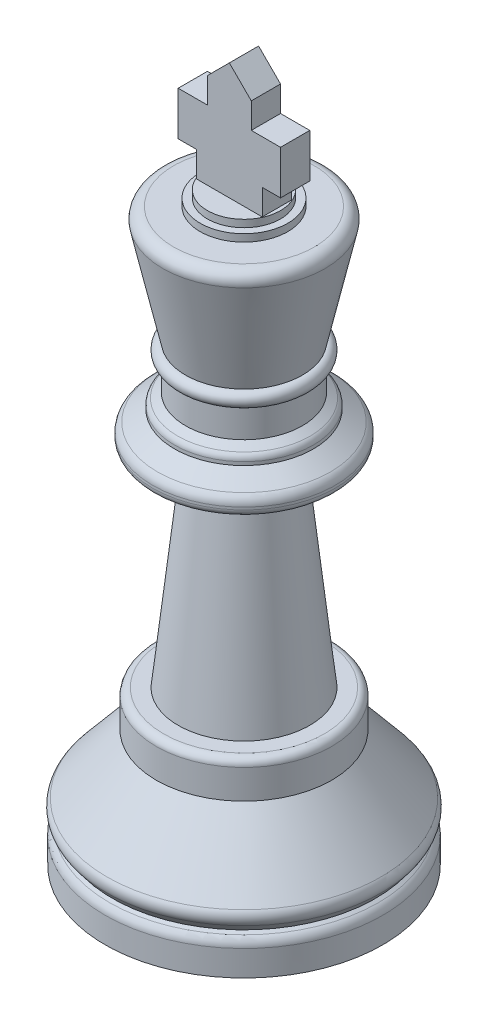
ISO-10303-21;
HEADER;
FILE_DESCRIPTION(('STEP AP214'),'2;1');
FILE_NAME('part.step','',(''),(''),'','','');
FILE_SCHEMA(('AUTOMOTIVE_DESIGN { 1 0 10303 214 1 1 1 1 }'));
ENDSEC;
DATA;
#1=APPLICATION_CONTEXT('core data for automotive mechanical design processes');
#2=APPLICATION_PROTOCOL_DEFINITION('international standard','automotive_design',2000,#1);
#3=PRODUCT_CONTEXT('',#1,'mechanical');
#4=PRODUCT('Part','Part','',(#3));
#5=PRODUCT_RELATED_PRODUCT_CATEGORY('part','',(#4));
#6=PRODUCT_DEFINITION_FORMATION('','',#4);
#7=PRODUCT_DEFINITION_CONTEXT('part definition',#1,'design');
#8=PRODUCT_DEFINITION('design','',#6,#7);
#9=PRODUCT_DEFINITION_SHAPE('','',#8);
#10=(LENGTH_UNIT() NAMED_UNIT(*) SI_UNIT(.MILLI.,.METRE.));
#11=(NAMED_UNIT(*) PLANE_ANGLE_UNIT() SI_UNIT($,.RADIAN.));
#12=(NAMED_UNIT(*) SI_UNIT($,.STERADIAN.) SOLID_ANGLE_UNIT());
#13=UNCERTAINTY_MEASURE_WITH_UNIT(LENGTH_MEASURE(1.E-05),#10,'distance_accuracy_value','');
#14=(GEOMETRIC_REPRESENTATION_CONTEXT(3) GLOBAL_UNCERTAINTY_ASSIGNED_CONTEXT((#13)) GLOBAL_UNIT_ASSIGNED_CONTEXT((#10,
#11,#12)) REPRESENTATION_CONTEXT('',''));
#15=CARTESIAN_POINT('',(0.,0.,0.));
#16=DIRECTION('',(0.,0.,1.));
#17=DIRECTION('',(1.,0.,0.));
#18=AXIS2_PLACEMENT_3D('',#15,#16,#17);
#19=CARTESIAN_POINT('',(0.,80.,0.));
#20=DIRECTION('',(0.,1.,0.));
#21=DIRECTION('',(0.,0.,1.));
#22=AXIS2_PLACEMENT_3D('',#19,#20,#21);
#23=PLANE('',#22);
#24=DIRECTION('',(0.,0.,1.));
#25=VECTOR('',#24,1.);
#26=CARTESIAN_POINT('',(-4.5,80.,-2.));
#27=LINE('',#26,#25);
#28=CARTESIAN_POINT('',(-4.5,80.,-2.));
#29=VERTEX_POINT('',#28);
#30=CARTESIAN_POINT('',(-4.5,80.,2.));
#31=VERTEX_POINT('',#30);
#32=EDGE_CURVE('E755',#29,#31,#27,.T.);
#33=ORIENTED_EDGE('',*,*,#32,.F.);
#34=DIRECTION('',(1.,0.,0.));
#35=VECTOR('',#34,1.);
#36=CARTESIAN_POINT('',(4.5,80.,-2.));
#37=LINE('',#36,#35);
#38=CARTESIAN_POINT('',(4.5,80.,-2.));
#39=VERTEX_POINT('',#38);
#40=EDGE_CURVE('E164',#29,#39,#37,.T.);
#41=ORIENTED_EDGE('',*,*,#40,.T.);
#42=DIRECTION('',(0.,0.,1.));
#43=VECTOR('',#42,1.);
#44=CARTESIAN_POINT('',(4.5,80.,-2.));
#45=LINE('',#44,#43);
#46=CARTESIAN_POINT('',(4.5,80.,2.));
#47=VERTEX_POINT('',#46);
#48=EDGE_CURVE('E193',#39,#47,#45,.T.);
#49=ORIENTED_EDGE('',*,*,#48,.T.);
#50=DIRECTION('',(1.,0.,0.));
#51=VECTOR('',#50,1.);
#52=CARTESIAN_POINT('',(4.5,80.,2.));
#53=LINE('',#52,#51);
#54=EDGE_CURVE('E752',#31,#47,#53,.T.);
#55=ORIENTED_EDGE('',*,*,#54,.F.);
#56=EDGE_LOOP('',(#33,#41,#49,#55));
#57=FACE_BOUND('',#56,.T.);
#58=CARTESIAN_POINT('',(0.,80.,0.));
#59=DIRECTION('',(0.,-1.,0.));
#60=DIRECTION('',(0.,0.,-1.));
#61=AXIS2_PLACEMENT_3D('',#58,#59,#60);
#62=CIRCLE('',#61,5.);
#63=CARTESIAN_POINT('',(0.,80.,-5.));
#64=VERTEX_POINT('',#63);
#65=EDGE_CURVE('E155',#64,#64,#62,.T.);
#66=ORIENTED_EDGE('',*,*,#65,.F.);
#67=EDGE_LOOP('',(#66));
#68=FACE_BOUND('',#67,.T.);
#69=ADVANCED_FACE('F39',(#57,#68),#23,.T.);
#70=CARTESIAN_POINT('',(19.,0.,0.));
#71=DIRECTION('',(0.,-1.,0.));
#72=DIRECTION('',(0.,0.,-1.));
#73=AXIS2_PLACEMENT_3D('',#70,#71,#72);
#74=PLANE('',#73);
#75=CARTESIAN_POINT('',(0.,0.,0.));
#76=DIRECTION('',(0.,-1.,0.));
#77=DIRECTION('',(0.,0.,-1.));
#78=AXIS2_PLACEMENT_3D('',#75,#76,#77);
#79=CIRCLE('',#78,19.);
#80=CARTESIAN_POINT('',(0.,0.,-19.));
#81=VERTEX_POINT('',#80);
#82=EDGE_CURVE('E259',#81,#81,#79,.T.);
#83=ORIENTED_EDGE('',*,*,#82,.T.);
#84=EDGE_LOOP('',(#83));
#85=FACE_BOUND('',#84,.T.);
#86=ADVANCED_FACE('F327',(#85),#74,.T.);
#87=CARTESIAN_POINT('',(0.,0.,0.));
#88=DIRECTION('',(0.,-1.,0.));
#89=DIRECTION('',(0.,0.,-1.));
#90=AXIS2_PLACEMENT_3D('',#87,#88,#89);
#91=CYLINDRICAL_SURFACE('',#90,19.);
#92=CARTESIAN_POINT('',(0.,3.5,0.));
#93=DIRECTION('',(0.,1.,0.));
#94=DIRECTION('',(0.,0.,1.));
#95=AXIS2_PLACEMENT_3D('',#92,#93,#94);
#96=CIRCLE('',#95,19.);
#97=CARTESIAN_POINT('',(0.,3.5,19.));
#98=VERTEX_POINT('',#97);
#99=EDGE_CURVE('E263',#98,#98,#96,.F.);
#100=ORIENTED_EDGE('',*,*,#99,.T.);
#101=EDGE_LOOP('',(#100));
#102=FACE_BOUND('',#101,.T.);
#103=ORIENTED_EDGE('',*,*,#82,.F.);
#104=EDGE_LOOP('',(#103));
#105=FACE_BOUND('',#104,.T.);
#106=ADVANCED_FACE('F333',(#102,#105),#91,.T.);
#107=CARTESIAN_POINT('',(0.,4.25,0.));
#108=DIRECTION('',(0.,-1.,0.));
#109=DIRECTION('',(0.,0.,-1.));
#110=AXIS2_PLACEMENT_3D('',#107,#108,#109);
#111=CONICAL_SURFACE('',#110,19.,0.927295218001615);
#112=CARTESIAN_POINT('',(0.,4.7,0.));
#113=DIRECTION('',(0.,1.,0.));
#114=DIRECTION('',(0.,0.,1.));
#115=AXIS2_PLACEMENT_3D('',#112,#113,#114);
#116=CIRCLE('',#115,18.4);
#117=CARTESIAN_POINT('',(0.,4.7,18.4));
#118=VERTEX_POINT('',#117);
#119=EDGE_CURVE('E267',#118,#118,#116,.T.);
#120=ORIENTED_EDGE('',*,*,#119,.T.);
#121=EDGE_LOOP('',(#120));
#122=FACE_BOUND('',#121,.T.);
#123=CARTESIAN_POINT('',(0.,5.,0.));
#124=DIRECTION('',(0.,-1.,0.));
#125=DIRECTION('',(0.,0.,-1.));
#126=AXIS2_PLACEMENT_3D('',#123,#124,#125);
#127=CIRCLE('',#126,18.);
#128=CARTESIAN_POINT('',(0.,5.,-18.));
#129=VERTEX_POINT('',#128);
#130=EDGE_CURVE('E255',#129,#129,#127,.T.);
#131=ORIENTED_EDGE('',*,*,#130,.T.);
#132=EDGE_LOOP('',(#131));
#133=FACE_BOUND('',#132,.T.);
#134=ADVANCED_FACE('F407',(#122,#133),#111,.T.);
#135=CARTESIAN_POINT('',(0.,5.,0.));
#136=DIRECTION('',(0.,1.,0.));
#137=DIRECTION('',(0.,0.,1.));
#138=AXIS2_PLACEMENT_3D('',#135,#136,#137);
#139=CONICAL_SURFACE('',#138,18.,0.643501108793284);
#140=CARTESIAN_POINT('',(0.,6.05101320906738,0.));
#141=DIRECTION('',(0.,-1.,0.));
#142=DIRECTION('',(0.,0.,-1.));
#143=AXIS2_PLACEMENT_3D('',#140,#141,#142);
#144=CIRCLE('',#143,18.7882599068005);
#145=CARTESIAN_POINT('',(0.,6.05101320906738,-18.7882599068005));
#146=VERTEX_POINT('',#145);
#147=EDGE_CURVE('E271',#146,#146,#144,.T.);
#148=ORIENTED_EDGE('',*,*,#147,.T.);
#149=EDGE_LOOP('',(#148));
#150=FACE_BOUND('',#149,.T.);
#151=ORIENTED_EDGE('',*,*,#130,.F.);
#152=EDGE_LOOP('',(#151));
#153=FACE_BOUND('',#152,.T.);
#154=ADVANCED_FACE('F403',(#150,#153),#139,.T.);
#155=CARTESIAN_POINT('',(0.,7.,0.));
#156=DIRECTION('',(0.,-1.,0.));
#157=DIRECTION('',(0.,0.,-1.));
#158=AXIS2_PLACEMENT_3D('',#155,#156,#157);
#159=CONICAL_SURFACE('',#158,19.5,0.694738276196703);
#160=CARTESIAN_POINT('',(0.,7.91128980856409,0.));
#161=DIRECTION('',(0.,1.,0.));
#162=DIRECTION('',(0.,0.,1.));
#163=AXIS2_PLACEMENT_3D('',#160,#161,#162);
#164=CIRCLE('',#163,18.7405918261966);
#165=CARTESIAN_POINT('',(0.,7.91128980856409,18.7405918261966));
#166=VERTEX_POINT('',#165);
#167=EDGE_CURVE('E275',#166,#166,#164,.T.);
#168=ORIENTED_EDGE('',*,*,#167,.T.);
#169=EDGE_LOOP('',(#168));
#170=FACE_BOUND('',#169,.T.);
#171=CARTESIAN_POINT('',(0.,16.,0.));
#172=DIRECTION('',(0.,-1.,0.));
#173=DIRECTION('',(0.,0.,-1.));
#174=AXIS2_PLACEMENT_3D('',#171,#172,#173);
#175=CIRCLE('',#174,12.);
#176=CARTESIAN_POINT('',(0.,16.,-12.));
#177=VERTEX_POINT('',#176);
#178=EDGE_CURVE('E251',#177,#177,#175,.T.);
#179=ORIENTED_EDGE('',*,*,#178,.T.);
#180=EDGE_LOOP('',(#179));
#181=FACE_BOUND('',#180,.T.);
#182=ADVANCED_FACE('F400',(#170,#181),#159,.T.);
#183=CARTESIAN_POINT('',(0.,0.,0.));
#184=DIRECTION('',(0.,-1.,0.));
#185=DIRECTION('',(0.,0.,-1.));
#186=AXIS2_PLACEMENT_3D('',#183,#184,#185);
#187=CYLINDRICAL_SURFACE('',#186,12.);
#188=CARTESIAN_POINT('',(0.,20.,0.));
#189=DIRECTION('',(0.,1.,0.));
#190=DIRECTION('',(0.,0.,1.));
#191=AXIS2_PLACEMENT_3D('',#188,#189,#190);
#192=CIRCLE('',#191,12.);
#193=CARTESIAN_POINT('',(0.,20.,12.));
#194=VERTEX_POINT('',#193);
#195=EDGE_CURVE('E48',#194,#194,#192,.F.);
#196=ORIENTED_EDGE('',*,*,#195,.T.);
#197=EDGE_LOOP('',(#196));
#198=FACE_BOUND('',#197,.T.);
#199=ORIENTED_EDGE('',*,*,#178,.F.);
#200=EDGE_LOOP('',(#199));
#201=FACE_BOUND('',#200,.T.);
#202=ADVANCED_FACE('F314',(#198,#201),#187,.T.);
#203=CARTESIAN_POINT('',(8.99999999999999,21.,0.));
#204=DIRECTION('',(0.,1.,0.));
#205=DIRECTION('',(0.,0.,1.));
#206=AXIS2_PLACEMENT_3D('',#203,#204,#205);
#207=PLANE('',#206);
#208=CARTESIAN_POINT('',(0.,21.,0.));
#209=DIRECTION('',(0.,1.,0.));
#210=DIRECTION('',(0.,0.,1.));
#211=AXIS2_PLACEMENT_3D('',#208,#209,#210);
#212=CIRCLE('',#211,11.);
#213=CARTESIAN_POINT('',(0.,21.,11.));
#214=VERTEX_POINT('',#213);
#215=EDGE_CURVE('E11',#214,#214,#212,.T.);
#216=ORIENTED_EDGE('',*,*,#215,.T.);
#217=EDGE_LOOP('',(#216));
#218=FACE_BOUND('',#217,.T.);
#219=CARTESIAN_POINT('',(0.,21.,0.));
#220=DIRECTION('',(0.,-1.,0.));
#221=DIRECTION('',(0.,0.,-1.));
#222=AXIS2_PLACEMENT_3D('',#219,#220,#221);
#223=CIRCLE('',#222,8.99999999999999);
#224=CARTESIAN_POINT('',(0.,21.,-8.99999999999999));
#225=VERTEX_POINT('',#224);
#226=EDGE_CURVE('E247',#225,#225,#223,.T.);
#227=ORIENTED_EDGE('',*,*,#226,.T.);
#228=EDGE_LOOP('',(#227));
#229=FACE_BOUND('',#228,.T.);
#230=ADVANCED_FACE('F393',(#218,#229),#207,.T.);
#231=CARTESIAN_POINT('',(0.,21.,0.));
#232=DIRECTION('',(0.,-1.,0.));
#233=DIRECTION('',(0.,0.,-1.));
#234=AXIS2_PLACEMENT_3D('',#231,#232,#233);
#235=CONICAL_SURFACE('',#234,8.99999999999999,0.106735672649136);
#236=CARTESIAN_POINT('',(0.,49.,0.));
#237=DIRECTION('',(0.,-1.,0.));
#238=DIRECTION('',(0.,0.,-1.));
#239=AXIS2_PLACEMENT_3D('',#236,#237,#238);
#240=CIRCLE('',#239,5.99999999999999);
#241=CARTESIAN_POINT('',(0.,49.,-5.99999999999999));
#242=VERTEX_POINT('',#241);
#243=EDGE_CURVE('E243',#242,#242,#240,.T.);
#244=ORIENTED_EDGE('',*,*,#243,.T.);
#245=EDGE_LOOP('',(#244));
#246=FACE_BOUND('',#245,.T.);
#247=ORIENTED_EDGE('',*,*,#226,.F.);
#248=EDGE_LOOP('',(#247));
#249=FACE_BOUND('',#248,.T.);
#250=ADVANCED_FACE('F389',(#246,#249),#235,.T.);
#251=CARTESIAN_POINT('',(0.,49.,0.));
#252=DIRECTION('',(0.,1.,0.));
#253=DIRECTION('',(0.,0.,1.));
#254=AXIS2_PLACEMENT_3D('',#251,#252,#253);
#255=CONICAL_SURFACE('',#254,5.99999999999999,1.41814699839963);
#256=CARTESIAN_POINT('',(0.,49.869547259116,0.));
#257=DIRECTION('',(0.,-1.,0.));
#258=DIRECTION('',(0.,0.,-1.));
#259=AXIS2_PLACEMENT_3D('',#256,#257,#258);
#260=CIRCLE('',#259,11.6520571842539);
#261=CARTESIAN_POINT('',(0.,49.869547259116,-11.6520571842539));
#262=VERTEX_POINT('',#261);
#263=EDGE_CURVE('E303',#262,#262,#260,.T.);
#264=ORIENTED_EDGE('',*,*,#263,.T.);
#265=EDGE_LOOP('',(#264));
#266=FACE_BOUND('',#265,.T.);
#267=ORIENTED_EDGE('',*,*,#243,.F.);
#268=EDGE_LOOP('',(#267));
#269=FACE_BOUND('',#268,.T.);
#270=ADVANCED_FACE('F385',(#266,#269),#255,.T.);
#271=CARTESIAN_POINT('',(0.,0.,0.));
#272=DIRECTION('',(0.,-1.,0.));
#273=DIRECTION('',(0.,0.,-1.));
#274=AXIS2_PLACEMENT_3D('',#271,#272,#273);
#275=CYLINDRICAL_SURFACE('',#274,12.5);
#276=CARTESIAN_POINT('',(0.,50.8579189567666,0.));
#277=DIRECTION('',(0.,1.,0.));
#278=DIRECTION('',(0.,0.,1.));
#279=AXIS2_PLACEMENT_3D('',#276,#277,#278);
#280=CIRCLE('',#279,12.5);
#281=CARTESIAN_POINT('',(0.,50.8579189567666,12.5));
#282=VERTEX_POINT('',#281);
#283=EDGE_CURVE('E307',#282,#282,#280,.T.);
#284=ORIENTED_EDGE('',*,*,#283,.T.);
#285=EDGE_LOOP('',(#284));
#286=FACE_BOUND('',#285,.T.);
#287=CARTESIAN_POINT('',(0.,51.197224362268,0.));
#288=DIRECTION('',(0.,1.,0.));
#289=DIRECTION('',(0.,0.,1.));
#290=AXIS2_PLACEMENT_3D('',#287,#288,#289);
#291=CIRCLE('',#290,12.5);
#292=CARTESIAN_POINT('',(0.,51.197224362268,12.5));
#293=VERTEX_POINT('',#292);
#294=EDGE_CURVE('E279',#293,#293,#291,.F.);
#295=ORIENTED_EDGE('',*,*,#294,.T.);
#296=EDGE_LOOP('',(#295));
#297=FACE_BOUND('',#296,.T.);
#298=ADVANCED_FACE('F381',(#286,#297),#275,.T.);
#299=CARTESIAN_POINT('',(0.,52.,0.));
#300=DIRECTION('',(0.,-1.,0.));
#301=DIRECTION('',(0.,0.,-1.));
#302=AXIS2_PLACEMENT_3D('',#299,#300,#301);
#303=CONICAL_SURFACE('',#302,12.5,0.982793723247329);
#304=CARTESIAN_POINT('',(0.,52.4452998037748,0.));
#305=DIRECTION('',(0.,1.,0.));
#306=DIRECTION('',(0.,0.,1.));
#307=AXIS2_PLACEMENT_3D('',#304,#305,#306);
#308=CIRCLE('',#307,11.8320502943378);
#309=CARTESIAN_POINT('',(0.,52.4452998037748,11.8320502943378));
#310=VERTEX_POINT('',#309);
#311=EDGE_CURVE('E283',#310,#310,#308,.T.);
#312=ORIENTED_EDGE('',*,*,#311,.T.);
#313=EDGE_LOOP('',(#312));
#314=FACE_BOUND('',#313,.T.);
#315=CARTESIAN_POINT('',(0.,54.,0.));
#316=DIRECTION('',(0.,-1.,0.));
#317=DIRECTION('',(0.,0.,-1.));
#318=AXIS2_PLACEMENT_3D('',#315,#316,#317);
#319=CIRCLE('',#318,9.49999999999999);
#320=CARTESIAN_POINT('',(0.,54.,-9.49999999999999));
#321=VERTEX_POINT('',#320);
#322=EDGE_CURVE('E239',#321,#321,#319,.T.);
#323=ORIENTED_EDGE('',*,*,#322,.T.);
#324=EDGE_LOOP('',(#323));
#325=FACE_BOUND('',#324,.T.);
#326=ADVANCED_FACE('F377',(#314,#325),#303,.T.);
#327=CARTESIAN_POINT('',(0.,0.,0.));
#328=DIRECTION('',(0.,-1.,0.));
#329=DIRECTION('',(0.,0.,-1.));
#330=AXIS2_PLACEMENT_3D('',#327,#328,#329);
#331=CYLINDRICAL_SURFACE('',#330,9.49999999999999);
#332=CARTESIAN_POINT('',(0.,54.464816241512,0.));
#333=DIRECTION('',(0.,1.,0.));
#334=DIRECTION('',(0.,0.,1.));
#335=AXIS2_PLACEMENT_3D('',#332,#333,#334);
#336=CIRCLE('',#335,9.49999999999999);
#337=CARTESIAN_POINT('',(0.,54.464816241512,9.49999999999999));
#338=VERTEX_POINT('',#337);
#339=EDGE_CURVE('E295',#338,#338,#336,.F.);
#340=ORIENTED_EDGE('',*,*,#339,.T.);
#341=EDGE_LOOP('',(#340));
#342=FACE_BOUND('',#341,.T.);
#343=ORIENTED_EDGE('',*,*,#322,.F.);
#344=EDGE_LOOP('',(#343));
#345=FACE_BOUND('',#344,.T.);
#346=ADVANCED_FACE('F373',(#342,#345),#331,.T.);
#347=CARTESIAN_POINT('',(0.,55.,0.));
#348=DIRECTION('',(0.,-1.,0.));
#349=DIRECTION('',(0.,0.,-1.));
#350=AXIS2_PLACEMENT_3D('',#347,#348,#349);
#351=CONICAL_SURFACE('',#350,9.49999999999999,0.982793723247324);
#352=CARTESIAN_POINT('',(0.,55.2968665358499,0.));
#353=DIRECTION('',(0.,1.,0.));
#354=DIRECTION('',(0.,0.,1.));
#355=AXIS2_PLACEMENT_3D('',#352,#353,#354);
#356=CIRCLE('',#355,9.05470019622522);
#357=CARTESIAN_POINT('',(0.,55.2968665358499,9.05470019622522));
#358=VERTEX_POINT('',#357);
#359=EDGE_CURVE('E299',#358,#358,#356,.T.);
#360=ORIENTED_EDGE('',*,*,#359,.T.);
#361=EDGE_LOOP('',(#360));
#362=FACE_BOUND('',#361,.T.);
#363=CARTESIAN_POINT('',(0.,56.,0.));
#364=DIRECTION('',(0.,-1.,0.));
#365=DIRECTION('',(0.,0.,-1.));
#366=AXIS2_PLACEMENT_3D('',#363,#364,#365);
#367=CIRCLE('',#366,8.);
#368=CARTESIAN_POINT('',(0.,56.,-8.));
#369=VERTEX_POINT('',#368);
#370=EDGE_CURVE('E235',#369,#369,#367,.T.);
#371=ORIENTED_EDGE('',*,*,#370,.T.);
#372=EDGE_LOOP('',(#371));
#373=FACE_BOUND('',#372,.T.);
#374=ADVANCED_FACE('F369',(#362,#373),#351,.T.);
#375=CARTESIAN_POINT('',(0.,0.,0.));
#376=DIRECTION('',(0.,-1.,0.));
#377=DIRECTION('',(0.,0.,-1.));
#378=AXIS2_PLACEMENT_3D('',#375,#376,#377);
#379=CYLINDRICAL_SURFACE('',#378,8.);
#380=CARTESIAN_POINT('',(0.,60.,0.));
#381=DIRECTION('',(0.,-1.,0.));
#382=DIRECTION('',(0.,0.,-1.));
#383=AXIS2_PLACEMENT_3D('',#380,#381,#382);
#384=CIRCLE('',#383,8.);
#385=CARTESIAN_POINT('',(0.,60.,-8.));
#386=VERTEX_POINT('',#385);
#387=EDGE_CURVE('E231',#386,#386,#384,.T.);
#388=ORIENTED_EDGE('',*,*,#387,.T.);
#389=EDGE_LOOP('',(#388));
#390=FACE_BOUND('',#389,.T.);
#391=ORIENTED_EDGE('',*,*,#370,.F.);
#392=EDGE_LOOP('',(#391));
#393=FACE_BOUND('',#392,.T.);
#394=ADVANCED_FACE('F365',(#390,#393),#379,.T.);
#395=CARTESIAN_POINT('',(0.,61.,0.));
#396=DIRECTION('',(0.,-1.,0.));
#397=DIRECTION('',(0.,0.,-1.));
#398=AXIS2_PLACEMENT_3D('',#395,#396,#397);
#399=TOROIDAL_SURFACE('',#398,8.,1.);
#400=CARTESIAN_POINT('',(0.,62.,0.));
#401=DIRECTION('',(0.,-1.,0.));
#402=DIRECTION('',(0.,0.,-1.));
#403=AXIS2_PLACEMENT_3D('',#400,#401,#402);
#404=CIRCLE('',#403,8.);
#405=CARTESIAN_POINT('',(0.,62.,-8.));
#406=VERTEX_POINT('',#405);
#407=EDGE_CURVE('E227',#406,#406,#404,.T.);
#408=ORIENTED_EDGE('',*,*,#407,.T.);
#409=EDGE_LOOP('',(#408));
#410=FACE_BOUND('',#409,.T.);
#411=ORIENTED_EDGE('',*,*,#387,.F.);
#412=EDGE_LOOP('',(#411));
#413=FACE_BOUND('',#412,.T.);
#414=ADVANCED_FACE('F361',(#410,#413),#399,.T.);
#415=CARTESIAN_POINT('',(0.,62.,0.));
#416=DIRECTION('',(0.,1.,0.));
#417=DIRECTION('',(0.,0.,1.));
#418=AXIS2_PLACEMENT_3D('',#415,#416,#417);
#419=CONICAL_SURFACE('',#418,8.,0.215357699697738);
#420=CARTESIAN_POINT('',(0.,76.1794546817919,0.));
#421=DIRECTION('',(0.,-1.,0.));
#422=DIRECTION('',(0.,0.,-1.));
#423=AXIS2_PLACEMENT_3D('',#420,#421,#422);
#424=CIRCLE('',#423,11.101755711642);
#425=CARTESIAN_POINT('',(0.,76.1794546817919,-11.101755711642));
#426=VERTEX_POINT('',#425);
#427=EDGE_CURVE('E287',#426,#426,#424,.T.);
#428=ORIENTED_EDGE('',*,*,#427,.T.);
#429=EDGE_LOOP('',(#428));
#430=FACE_BOUND('',#429,.T.);
#431=ORIENTED_EDGE('',*,*,#407,.F.);
#432=EDGE_LOOP('',(#431));
#433=FACE_BOUND('',#432,.T.);
#434=ADVANCED_FACE('F357',(#430,#433),#419,.T.);
#435=CARTESIAN_POINT('',(5.99999999999999,78.,0.));
#436=DIRECTION('',(0.,1.,0.));
#437=DIRECTION('',(0.,0.,1.));
#438=AXIS2_PLACEMENT_3D('',#435,#436,#437);
#439=PLANE('',#438);
#440=CARTESIAN_POINT('',(0.,78.,0.));
#441=DIRECTION('',(0.,1.,0.));
#442=DIRECTION('',(0.,0.,1.));
#443=AXIS2_PLACEMENT_3D('',#440,#441,#442);
#444=CIRCLE('',#443,9.63640568554758);
#445=CARTESIAN_POINT('',(0.,78.,9.63640568554758));
#446=VERTEX_POINT('',#445);
#447=EDGE_CURVE('E291',#446,#446,#444,.T.);
#448=ORIENTED_EDGE('',*,*,#447,.T.);
#449=EDGE_LOOP('',(#448));
#450=FACE_BOUND('',#449,.T.);
#451=CARTESIAN_POINT('',(0.,78.,0.));
#452=DIRECTION('',(0.,-1.,0.));
#453=DIRECTION('',(0.,0.,-1.));
#454=AXIS2_PLACEMENT_3D('',#451,#452,#453);
#455=CIRCLE('',#454,5.99999999999999);
#456=CARTESIAN_POINT('',(0.,78.,-5.99999999999999));
#457=VERTEX_POINT('',#456);
#458=EDGE_CURVE('E223',#457,#457,#455,.T.);
#459=ORIENTED_EDGE('',*,*,#458,.T.);
#460=EDGE_LOOP('',(#459));
#461=FACE_BOUND('',#460,.T.);
#462=ADVANCED_FACE('F353',(#450,#461),#439,.T.);
#463=CARTESIAN_POINT('',(0.,0.,0.));
#464=DIRECTION('',(0.,-1.,0.));
#465=DIRECTION('',(0.,0.,-1.));
#466=AXIS2_PLACEMENT_3D('',#463,#464,#465);
#467=CYLINDRICAL_SURFACE('',#466,5.99999999999999);
#468=CARTESIAN_POINT('',(0.,79.,0.));
#469=DIRECTION('',(0.,-1.,0.));
#470=DIRECTION('',(0.,0.,-1.));
#471=AXIS2_PLACEMENT_3D('',#468,#469,#470);
#472=CIRCLE('',#471,6.);
#473=CARTESIAN_POINT('',(0.,79.,-6.));
#474=VERTEX_POINT('',#473);
#475=EDGE_CURVE('E219',#474,#474,#472,.T.);
#476=ORIENTED_EDGE('',*,*,#475,.T.);
#477=EDGE_LOOP('',(#476));
#478=FACE_BOUND('',#477,.T.);
#479=ORIENTED_EDGE('',*,*,#458,.F.);
#480=EDGE_LOOP('',(#479));
#481=FACE_BOUND('',#480,.T.);
#482=ADVANCED_FACE('F349',(#478,#481),#467,.T.);
#483=CARTESIAN_POINT('',(5.,79.,0.));
#484=DIRECTION('',(0.,1.,0.));
#485=DIRECTION('',(0.,0.,1.));
#486=AXIS2_PLACEMENT_3D('',#483,#484,#485);
#487=PLANE('',#486);
#488=CARTESIAN_POINT('',(0.,79.,0.));
#489=DIRECTION('',(0.,-1.,0.));
#490=DIRECTION('',(0.,0.,-1.));
#491=AXIS2_PLACEMENT_3D('',#488,#489,#490);
#492=CIRCLE('',#491,5.);
#493=CARTESIAN_POINT('',(0.,79.,-5.));
#494=VERTEX_POINT('',#493);
#495=EDGE_CURVE('E215',#494,#494,#492,.T.);
#496=ORIENTED_EDGE('',*,*,#495,.T.);
#497=EDGE_LOOP('',(#496));
#498=FACE_BOUND('',#497,.T.);
#499=ORIENTED_EDGE('',*,*,#475,.F.);
#500=EDGE_LOOP('',(#499));
#501=FACE_BOUND('',#500,.T.);
#502=ADVANCED_FACE('F345',(#498,#501),#487,.T.);
#503=CARTESIAN_POINT('',(0.,0.,0.));
#504=DIRECTION('',(0.,-1.,0.));
#505=DIRECTION('',(0.,0.,-1.));
#506=AXIS2_PLACEMENT_3D('',#503,#504,#505);
#507=CYLINDRICAL_SURFACE('',#506,5.);
#508=ORIENTED_EDGE('',*,*,#65,.T.);
#509=EDGE_LOOP('',(#508));
#510=FACE_BOUND('',#509,.T.);
#511=ORIENTED_EDGE('',*,*,#495,.F.);
#512=EDGE_LOOP('',(#511));
#513=FACE_BOUND('',#512,.T.);
#514=ADVANCED_FACE('F342',(#510,#513),#507,.T.);
#515=CARTESIAN_POINT('',(0.,96.,-2.));
#516=DIRECTION('',(0.707106781186546,0.707106781186549,0.));
#517=DIRECTION('',(-0.707106781186549,0.707106781186546,0.));
#518=AXIS2_PLACEMENT_3D('',#515,#516,#517);
#519=PLANE('',#518);
#520=DIRECTION('',(0.,0.,1.));
#521=VECTOR('',#520,1.);
#522=CARTESIAN_POINT('',(0.,96.,-2.));
#523=LINE('',#522,#521);
#524=CARTESIAN_POINT('',(0.,96.,-2.));
#525=VERTEX_POINT('',#524);
#526=CARTESIAN_POINT('',(0.,96.,2.));
#527=VERTEX_POINT('',#526);
#528=EDGE_CURVE('E141',#525,#527,#523,.T.);
#529=ORIENTED_EDGE('',*,*,#528,.T.);
#530=DIRECTION('',(-0.707106781186549,0.707106781186546,0.));
#531=VECTOR('',#530,1.);
#532=CARTESIAN_POINT('',(0.,96.,2.));
#533=LINE('',#532,#531);
#534=CARTESIAN_POINT('',(3.,93.,2.));
#535=VERTEX_POINT('',#534);
#536=EDGE_CURVE('E152',#535,#527,#533,.T.);
#537=ORIENTED_EDGE('',*,*,#536,.F.);
#538=DIRECTION('',(0.,0.,1.));
#539=VECTOR('',#538,1.);
#540=CARTESIAN_POINT('',(3.,93.,-2.));
#541=LINE('',#540,#539);
#542=CARTESIAN_POINT('',(3.,93.,-2.));
#543=VERTEX_POINT('',#542);
#544=EDGE_CURVE('E63',#543,#535,#541,.T.);
#545=ORIENTED_EDGE('',*,*,#544,.F.);
#546=DIRECTION('',(-0.707106781186549,0.707106781186546,0.));
#547=VECTOR('',#546,1.);
#548=CARTESIAN_POINT('',(0.,96.,-2.));
#549=LINE('',#548,#547);
#550=EDGE_CURVE('E153',#543,#525,#549,.T.);
#551=ORIENTED_EDGE('',*,*,#550,.T.);
#552=EDGE_LOOP('',(#529,#537,#545,#551));
#553=FACE_BOUND('',#552,.T.);
#554=ADVANCED_FACE('F151',(#553),#519,.T.);
#555=CARTESIAN_POINT('',(3.,93.,-2.));
#556=DIRECTION('',(1.,0.,0.));
#557=DIRECTION('',(0.,1.,0.));
#558=AXIS2_PLACEMENT_3D('',#555,#556,#557);
#559=PLANE('',#558);
#560=ORIENTED_EDGE('',*,*,#544,.T.);
#561=DIRECTION('',(0.,1.,0.));
#562=VECTOR('',#561,1.);
#563=CARTESIAN_POINT('',(3.,93.,2.));
#564=LINE('',#563,#562);
#565=CARTESIAN_POINT('',(3.,89.4999999999999,2.));
#566=VERTEX_POINT('',#565);
#567=EDGE_CURVE('E162',#566,#535,#564,.T.);
#568=ORIENTED_EDGE('',*,*,#567,.F.);
#569=DIRECTION('',(0.,0.,1.));
#570=VECTOR('',#569,1.);
#571=CARTESIAN_POINT('',(3.,89.4999999999999,-2.));
#572=LINE('',#571,#570);
#573=CARTESIAN_POINT('',(3.,89.4999999999999,-2.));
#574=VERTEX_POINT('',#573);
#575=EDGE_CURVE('E197',#574,#566,#572,.T.);
#576=ORIENTED_EDGE('',*,*,#575,.F.);
#577=DIRECTION('',(0.,1.,0.));
#578=VECTOR('',#577,1.);
#579=CARTESIAN_POINT('',(3.,93.,-2.));
#580=LINE('',#579,#578);
#581=EDGE_CURVE('E188',#574,#543,#580,.T.);
#582=ORIENTED_EDGE('',*,*,#581,.T.);
#583=EDGE_LOOP('',(#560,#568,#576,#582));
#584=FACE_BOUND('',#583,.T.);
#585=ADVANCED_FACE('F563',(#584),#559,.T.);
#586=CARTESIAN_POINT('',(3.,89.4999999999999,-2.));
#587=DIRECTION('',(0.,1.,0.));
#588=DIRECTION('',(0.,0.,1.));
#589=AXIS2_PLACEMENT_3D('',#586,#587,#588);
#590=PLANE('',#589);
#591=ORIENTED_EDGE('',*,*,#575,.T.);
#592=DIRECTION('',(-1.,0.,0.));
#593=VECTOR('',#592,1.);
#594=CARTESIAN_POINT('',(3.,89.4999999999999,2.));
#595=LINE('',#594,#593);
#596=CARTESIAN_POINT('',(7.,89.4999999999999,2.));
#597=VERTEX_POINT('',#596);
#598=EDGE_CURVE('E170',#597,#566,#595,.T.);
#599=ORIENTED_EDGE('',*,*,#598,.F.);
#600=DIRECTION('',(0.,0.,1.));
#601=VECTOR('',#600,1.);
#602=CARTESIAN_POINT('',(7.,89.4999999999999,-2.));
#603=LINE('',#602,#601);
#604=CARTESIAN_POINT('',(7.,89.4999999999999,-2.));
#605=VERTEX_POINT('',#604);
#606=EDGE_CURVE('E200',#605,#597,#603,.T.);
#607=ORIENTED_EDGE('',*,*,#606,.F.);
#608=DIRECTION('',(-1.,0.,0.));
#609=VECTOR('',#608,1.);
#610=CARTESIAN_POINT('',(3.,89.4999999999999,-2.));
#611=LINE('',#610,#609);
#612=EDGE_CURVE('E184',#605,#574,#611,.T.);
#613=ORIENTED_EDGE('',*,*,#612,.T.);
#614=EDGE_LOOP('',(#591,#599,#607,#613));
#615=FACE_BOUND('',#614,.T.);
#616=ADVANCED_FACE('F596',(#615),#590,.T.);
#617=CARTESIAN_POINT('',(7.,89.4999999999999,-2.));
#618=DIRECTION('',(1.,0.,0.));
#619=DIRECTION('',(0.,1.,0.));
#620=AXIS2_PLACEMENT_3D('',#617,#618,#619);
#621=PLANE('',#620);
#622=ORIENTED_EDGE('',*,*,#606,.T.);
#623=DIRECTION('',(0.,1.,0.));
#624=VECTOR('',#623,1.);
#625=CARTESIAN_POINT('',(7.,89.4999999999999,2.));
#626=LINE('',#625,#624);
#627=CARTESIAN_POINT('',(7.,83.5,2.));
#628=VERTEX_POINT('',#627);
#629=EDGE_CURVE('E738',#628,#597,#626,.T.);
#630=ORIENTED_EDGE('',*,*,#629,.F.);
#631=DIRECTION('',(0.,0.,1.));
#632=VECTOR('',#631,1.);
#633=CARTESIAN_POINT('',(7.,83.5,-2.));
#634=LINE('',#633,#632);
#635=CARTESIAN_POINT('',(7.,83.5,-2.));
#636=VERTEX_POINT('',#635);
#637=EDGE_CURVE('E203',#636,#628,#634,.T.);
#638=ORIENTED_EDGE('',*,*,#637,.F.);
#639=DIRECTION('',(0.,1.,0.));
#640=VECTOR('',#639,1.);
#641=CARTESIAN_POINT('',(7.,89.4999999999999,-2.));
#642=LINE('',#641,#640);
#643=EDGE_CURVE('E180',#636,#605,#642,.T.);
#644=ORIENTED_EDGE('',*,*,#643,.T.);
#645=EDGE_LOOP('',(#622,#630,#638,#644));
#646=FACE_BOUND('',#645,.T.);
#647=ADVANCED_FACE('F587',(#646),#621,.T.);
#648=CARTESIAN_POINT('',(7.,83.5,-2.));
#649=DIRECTION('',(0.,-1.,0.));
#650=DIRECTION('',(0.,0.,-1.));
#651=AXIS2_PLACEMENT_3D('',#648,#649,#650);
#652=PLANE('',#651);
#653=ORIENTED_EDGE('',*,*,#637,.T.);
#654=DIRECTION('',(1.,0.,0.));
#655=VECTOR('',#654,1.);
#656=CARTESIAN_POINT('',(7.,83.5,2.));
#657=LINE('',#656,#655);
#658=CARTESIAN_POINT('',(4.5,83.5,2.));
#659=VERTEX_POINT('',#658);
#660=EDGE_CURVE('E742',#659,#628,#657,.T.);
#661=ORIENTED_EDGE('',*,*,#660,.F.);
#662=DIRECTION('',(0.,0.,1.));
#663=VECTOR('',#662,1.);
#664=CARTESIAN_POINT('',(4.5,83.5,-2.));
#665=LINE('',#664,#663);
#666=CARTESIAN_POINT('',(4.5,83.5,-2.));
#667=VERTEX_POINT('',#666);
#668=EDGE_CURVE('E206',#667,#659,#665,.T.);
#669=ORIENTED_EDGE('',*,*,#668,.F.);
#670=DIRECTION('',(1.,0.,0.));
#671=VECTOR('',#670,1.);
#672=CARTESIAN_POINT('',(7.,83.5,-2.));
#673=LINE('',#672,#671);
#674=EDGE_CURVE('E176',#667,#636,#673,.T.);
#675=ORIENTED_EDGE('',*,*,#674,.T.);
#676=EDGE_LOOP('',(#653,#661,#669,#675));
#677=FACE_BOUND('',#676,.T.);
#678=ADVANCED_FACE('F578',(#677),#652,.T.);
#679=CARTESIAN_POINT('',(4.5,83.5,-2.));
#680=DIRECTION('',(1.,0.,0.));
#681=DIRECTION('',(0.,1.,0.));
#682=AXIS2_PLACEMENT_3D('',#679,#680,#681);
#683=PLANE('',#682);
#684=ORIENTED_EDGE('',*,*,#668,.T.);
#685=DIRECTION('',(0.,1.,0.));
#686=VECTOR('',#685,1.);
#687=CARTESIAN_POINT('',(4.5,83.5,2.));
#688=LINE('',#687,#686);
#689=EDGE_CURVE('E747',#47,#659,#688,.T.);
#690=ORIENTED_EDGE('',*,*,#689,.F.);
#691=ORIENTED_EDGE('',*,*,#48,.F.);
#692=DIRECTION('',(0.,1.,0.));
#693=VECTOR('',#692,1.);
#694=CARTESIAN_POINT('',(4.5,83.5,-2.));
#695=LINE('',#694,#693);
#696=EDGE_CURVE('E55',#39,#667,#695,.T.);
#697=ORIENTED_EDGE('',*,*,#696,.T.);
#698=EDGE_LOOP('',(#684,#690,#691,#697));
#699=FACE_BOUND('',#698,.T.);
#700=ADVANCED_FACE('F340',(#699),#683,.T.);
#701=CARTESIAN_POINT('',(0.,0.,-2.));
#702=DIRECTION('',(0.,0.,-1.));
#703=DIRECTION('',(-1.,0.,0.));
#704=AXIS2_PLACEMENT_3D('',#701,#702,#703);
#705=PLANE('',#704);
#706=ORIENTED_EDGE('',*,*,#40,.F.);
#707=DIRECTION('',(0.,1.,0.));
#708=VECTOR('',#707,1.);
#709=CARTESIAN_POINT('',(-4.5,83.5,-2.));
#710=LINE('',#709,#708);
#711=CARTESIAN_POINT('',(-4.5,83.5,-2.));
#712=VERTEX_POINT('',#711);
#713=EDGE_CURVE('E759',#29,#712,#710,.T.);
#714=ORIENTED_EDGE('',*,*,#713,.T.);
#715=DIRECTION('',(-1.,0.,0.));
#716=VECTOR('',#715,1.);
#717=CARTESIAN_POINT('',(-7.,83.5,-2.));
#718=LINE('',#717,#716);
#719=CARTESIAN_POINT('',(-7.,83.5,-2.));
#720=VERTEX_POINT('',#719);
#721=EDGE_CURVE('E776',#712,#720,#718,.T.);
#722=ORIENTED_EDGE('',*,*,#721,.T.);
#723=DIRECTION('',(0.,1.,0.));
#724=VECTOR('',#723,1.);
#725=CARTESIAN_POINT('',(-7.,89.4999999999999,-2.));
#726=LINE('',#725,#724);
#727=CARTESIAN_POINT('',(-7.,89.4999999999999,-2.));
#728=VERTEX_POINT('',#727);
#729=EDGE_CURVE('E779',#720,#728,#726,.T.);
#730=ORIENTED_EDGE('',*,*,#729,.T.);
#731=DIRECTION('',(1.,0.,0.));
#732=VECTOR('',#731,1.);
#733=CARTESIAN_POINT('',(-3.,89.4999999999999,-2.));
#734=LINE('',#733,#732);
#735=CARTESIAN_POINT('',(-3.,89.4999999999999,-2.));
#736=VERTEX_POINT('',#735);
#737=EDGE_CURVE('E782',#728,#736,#734,.T.);
#738=ORIENTED_EDGE('',*,*,#737,.T.);
#739=DIRECTION('',(0.,1.,0.));
#740=VECTOR('',#739,1.);
#741=CARTESIAN_POINT('',(-3.,93.,-2.));
#742=LINE('',#741,#740);
#743=CARTESIAN_POINT('',(-3.,93.,-2.));
#744=VERTEX_POINT('',#743);
#745=EDGE_CURVE('E785',#736,#744,#742,.T.);
#746=ORIENTED_EDGE('',*,*,#745,.T.);
#747=DIRECTION('',(0.707106781186549,0.707106781186546,0.));
#748=VECTOR('',#747,1.);
#749=CARTESIAN_POINT('',(0.,96.,-2.));
#750=LINE('',#749,#748);
#751=EDGE_CURVE('E788',#744,#525,#750,.T.);
#752=ORIENTED_EDGE('',*,*,#751,.T.);
#753=ORIENTED_EDGE('',*,*,#550,.F.);
#754=ORIENTED_EDGE('',*,*,#581,.F.);
#755=ORIENTED_EDGE('',*,*,#612,.F.);
#756=ORIENTED_EDGE('',*,*,#643,.F.);
#757=ORIENTED_EDGE('',*,*,#674,.F.);
#758=ORIENTED_EDGE('',*,*,#696,.F.);
#759=EDGE_LOOP('',(#706,#714,#722,#730,#738,#746,#752,#753,#754,#755,#756,#757,#758));
#760=FACE_BOUND('',#759,.T.);
#761=ADVANCED_FACE('F542',(#760),#705,.T.);
#762=CARTESIAN_POINT('',(0.,0.,2.));
#763=DIRECTION('',(0.,0.,-1.));
#764=DIRECTION('',(-1.,0.,0.));
#765=AXIS2_PLACEMENT_3D('',#762,#763,#764);
#766=PLANE('',#765);
#767=ORIENTED_EDGE('',*,*,#54,.T.);
#768=ORIENTED_EDGE('',*,*,#689,.T.);
#769=ORIENTED_EDGE('',*,*,#660,.T.);
#770=ORIENTED_EDGE('',*,*,#629,.T.);
#771=ORIENTED_EDGE('',*,*,#598,.T.);
#772=ORIENTED_EDGE('',*,*,#567,.T.);
#773=ORIENTED_EDGE('',*,*,#536,.T.);
#774=DIRECTION('',(0.707106781186549,0.707106781186546,0.));
#775=VECTOR('',#774,1.);
#776=CARTESIAN_POINT('',(0.,96.,2.));
#777=LINE('',#776,#775);
#778=CARTESIAN_POINT('',(-3.,93.,2.));
#779=VERTEX_POINT('',#778);
#780=EDGE_CURVE('E137',#779,#527,#777,.T.);
#781=ORIENTED_EDGE('',*,*,#780,.F.);
#782=DIRECTION('',(0.,1.,0.));
#783=VECTOR('',#782,1.);
#784=CARTESIAN_POINT('',(-3.,93.,2.));
#785=LINE('',#784,#783);
#786=CARTESIAN_POINT('',(-3.,89.4999999999999,2.));
#787=VERTEX_POINT('',#786);
#788=EDGE_CURVE('E149',#787,#779,#785,.T.);
#789=ORIENTED_EDGE('',*,*,#788,.F.);
#790=DIRECTION('',(1.,0.,0.));
#791=VECTOR('',#790,1.);
#792=CARTESIAN_POINT('',(-3.,89.4999999999999,2.));
#793=LINE('',#792,#791);
#794=CARTESIAN_POINT('',(-7.,89.4999999999999,2.));
#795=VERTEX_POINT('',#794);
#796=EDGE_CURVE('E803',#795,#787,#793,.T.);
#797=ORIENTED_EDGE('',*,*,#796,.F.);
#798=DIRECTION('',(0.,1.,0.));
#799=VECTOR('',#798,1.);
#800=CARTESIAN_POINT('',(-7.,89.4999999999999,2.));
#801=LINE('',#800,#799);
#802=CARTESIAN_POINT('',(-7.,83.5,2.));
#803=VERTEX_POINT('',#802);
#804=EDGE_CURVE('E799',#803,#795,#801,.T.);
#805=ORIENTED_EDGE('',*,*,#804,.F.);
#806=DIRECTION('',(-1.,0.,0.));
#807=VECTOR('',#806,1.);
#808=CARTESIAN_POINT('',(-7.,83.5,2.));
#809=LINE('',#808,#807);
#810=CARTESIAN_POINT('',(-4.5,83.5,2.));
#811=VERTEX_POINT('',#810);
#812=EDGE_CURVE('E795',#811,#803,#809,.T.);
#813=ORIENTED_EDGE('',*,*,#812,.F.);
#814=DIRECTION('',(0.,1.,0.));
#815=VECTOR('',#814,1.);
#816=CARTESIAN_POINT('',(-4.5,83.5,2.));
#817=LINE('',#816,#815);
#818=EDGE_CURVE('E791',#31,#811,#817,.T.);
#819=ORIENTED_EDGE('',*,*,#818,.F.);
#820=EDGE_LOOP('',(#767,#768,#769,#770,#771,#772,#773,#781,#789,#797,#805,#813,#819));
#821=FACE_BOUND('',#820,.T.);
#822=ADVANCED_FACE('F159',(#821),#766,.F.);
#823=CARTESIAN_POINT('',(-4.5,83.5,-2.));
#824=DIRECTION('',(1.,0.,0.));
#825=DIRECTION('',(0.,1.,0.));
#826=AXIS2_PLACEMENT_3D('',#823,#824,#825);
#827=PLANE('',#826);
#828=ORIENTED_EDGE('',*,*,#32,.T.);
#829=ORIENTED_EDGE('',*,*,#818,.T.);
#830=DIRECTION('',(0.,0.,1.));
#831=VECTOR('',#830,1.);
#832=CARTESIAN_POINT('',(-4.5,83.5,-2.));
#833=LINE('',#832,#831);
#834=EDGE_CURVE('E768',#712,#811,#833,.T.);
#835=ORIENTED_EDGE('',*,*,#834,.F.);
#836=ORIENTED_EDGE('',*,*,#713,.F.);
#837=EDGE_LOOP('',(#828,#829,#835,#836));
#838=FACE_BOUND('',#837,.T.);
#839=ADVANCED_FACE('F524',(#838),#827,.F.);
#840=CARTESIAN_POINT('',(-7.,83.5,-2.));
#841=DIRECTION('',(0.,1.,0.));
#842=DIRECTION('',(0.,0.,1.));
#843=AXIS2_PLACEMENT_3D('',#840,#841,#842);
#844=PLANE('',#843);
#845=ORIENTED_EDGE('',*,*,#834,.T.);
#846=ORIENTED_EDGE('',*,*,#812,.T.);
#847=DIRECTION('',(0.,0.,1.));
#848=VECTOR('',#847,1.);
#849=CARTESIAN_POINT('',(-7.,83.5,-2.));
#850=LINE('',#849,#848);
#851=EDGE_CURVE('E765',#720,#803,#850,.T.);
#852=ORIENTED_EDGE('',*,*,#851,.F.);
#853=ORIENTED_EDGE('',*,*,#721,.F.);
#854=EDGE_LOOP('',(#845,#846,#852,#853));
#855=FACE_BOUND('',#854,.T.);
#856=ADVANCED_FACE('F515',(#855),#844,.F.);
#857=CARTESIAN_POINT('',(-7.,89.4999999999999,-2.));
#858=DIRECTION('',(1.,0.,0.));
#859=DIRECTION('',(0.,1.,0.));
#860=AXIS2_PLACEMENT_3D('',#857,#858,#859);
#861=PLANE('',#860);
#862=ORIENTED_EDGE('',*,*,#851,.T.);
#863=ORIENTED_EDGE('',*,*,#804,.T.);
#864=DIRECTION('',(0.,0.,1.));
#865=VECTOR('',#864,1.);
#866=CARTESIAN_POINT('',(-7.,89.4999999999999,-2.));
#867=LINE('',#866,#865);
#868=EDGE_CURVE('E762',#728,#795,#867,.T.);
#869=ORIENTED_EDGE('',*,*,#868,.F.);
#870=ORIENTED_EDGE('',*,*,#729,.F.);
#871=EDGE_LOOP('',(#862,#863,#869,#870));
#872=FACE_BOUND('',#871,.T.);
#873=ADVANCED_FACE('F506',(#872),#861,.F.);
#874=CARTESIAN_POINT('',(-3.,89.4999999999999,-2.));
#875=DIRECTION('',(0.,-1.,0.));
#876=DIRECTION('',(0.,0.,-1.));
#877=AXIS2_PLACEMENT_3D('',#874,#875,#876);
#878=PLANE('',#877);
#879=ORIENTED_EDGE('',*,*,#868,.T.);
#880=ORIENTED_EDGE('',*,*,#796,.T.);
#881=DIRECTION('',(0.,0.,1.));
#882=VECTOR('',#881,1.);
#883=CARTESIAN_POINT('',(-3.,89.4999999999999,-2.));
#884=LINE('',#883,#882);
#885=EDGE_CURVE('E758',#736,#787,#884,.T.);
#886=ORIENTED_EDGE('',*,*,#885,.F.);
#887=ORIENTED_EDGE('',*,*,#737,.F.);
#888=EDGE_LOOP('',(#879,#880,#886,#887));
#889=FACE_BOUND('',#888,.T.);
#890=ADVANCED_FACE('F497',(#889),#878,.F.);
#891=CARTESIAN_POINT('',(-3.,93.,-2.));
#892=DIRECTION('',(1.,0.,0.));
#893=DIRECTION('',(0.,1.,0.));
#894=AXIS2_PLACEMENT_3D('',#891,#892,#893);
#895=PLANE('',#894);
#896=ORIENTED_EDGE('',*,*,#885,.T.);
#897=ORIENTED_EDGE('',*,*,#788,.T.);
#898=DIRECTION('',(0.,0.,1.));
#899=VECTOR('',#898,1.);
#900=CARTESIAN_POINT('',(-3.,93.,-2.));
#901=LINE('',#900,#899);
#902=EDGE_CURVE('E143',#744,#779,#901,.T.);
#903=ORIENTED_EDGE('',*,*,#902,.F.);
#904=ORIENTED_EDGE('',*,*,#745,.F.);
#905=EDGE_LOOP('',(#896,#897,#903,#904));
#906=FACE_BOUND('',#905,.T.);
#907=ADVANCED_FACE('F488',(#906),#895,.F.);
#908=CARTESIAN_POINT('',(0.,96.,-2.));
#909=DIRECTION('',(0.707106781186546,-0.707106781186549,0.));
#910=DIRECTION('',(0.707106781186549,0.707106781186546,0.));
#911=AXIS2_PLACEMENT_3D('',#908,#909,#910);
#912=PLANE('',#911);
#913=ORIENTED_EDGE('',*,*,#902,.T.);
#914=ORIENTED_EDGE('',*,*,#780,.T.);
#915=ORIENTED_EDGE('',*,*,#528,.F.);
#916=ORIENTED_EDGE('',*,*,#751,.F.);
#917=EDGE_LOOP('',(#913,#914,#915,#916));
#918=FACE_BOUND('',#917,.T.);
#919=ADVANCED_FACE('F139',(#918),#912,.F.);
#920=CARTESIAN_POINT('',(0.,3.5,0.));
#921=DIRECTION('',(0.,1.,0.));
#922=DIRECTION('',(0.,0.,1.));
#923=AXIS2_PLACEMENT_3D('',#920,#921,#922);
#924=TOROIDAL_SURFACE('',#923,17.5,1.5);
#925=ORIENTED_EDGE('',*,*,#119,.F.);
#926=EDGE_LOOP('',(#925));
#927=FACE_BOUND('',#926,.T.);
#928=ORIENTED_EDGE('',*,*,#99,.F.);
#929=EDGE_LOOP('',(#928));
#930=FACE_BOUND('',#929,.T.);
#931=ADVANCED_FACE('F415',(#927,#930),#924,.T.);
#932=CARTESIAN_POINT('',(0.,6.95101320906737,0.));
#933=DIRECTION('',(0.,1.,0.));
#934=DIRECTION('',(0.,0.,1.));
#935=AXIS2_PLACEMENT_3D('',#932,#933,#934);
#936=TOROIDAL_SURFACE('',#935,17.5882599068005,1.5);
#937=ORIENTED_EDGE('',*,*,#167,.F.);
#938=EDGE_LOOP('',(#937));
#939=FACE_BOUND('',#938,.T.);
#940=ORIENTED_EDGE('',*,*,#147,.F.);
#941=EDGE_LOOP('',(#940));
#942=FACE_BOUND('',#941,.T.);
#943=ADVANCED_FACE('F418',(#939,#942),#936,.T.);
#944=CARTESIAN_POINT('',(0.,51.197224362268,0.));
#945=DIRECTION('',(0.,1.,0.));
#946=DIRECTION('',(0.,0.,1.));
#947=AXIS2_PLACEMENT_3D('',#944,#945,#946);
#948=TOROIDAL_SURFACE('',#947,11.,1.5);
#949=ORIENTED_EDGE('',*,*,#311,.F.);
#950=EDGE_LOOP('',(#949));
#951=FACE_BOUND('',#950,.T.);
#952=ORIENTED_EDGE('',*,*,#294,.F.);
#953=EDGE_LOOP('',(#952));
#954=FACE_BOUND('',#953,.T.);
#955=ADVANCED_FACE('F422',(#951,#954),#948,.T.);
#956=CARTESIAN_POINT('',(0.,76.5,0.));
#957=DIRECTION('',(0.,1.,0.));
#958=DIRECTION('',(0.,0.,1.));
#959=AXIS2_PLACEMENT_3D('',#956,#957,#958);
#960=TOROIDAL_SURFACE('',#959,9.63640568554758,1.5);
#961=ORIENTED_EDGE('',*,*,#447,.F.);
#962=EDGE_LOOP('',(#961));
#963=FACE_BOUND('',#962,.T.);
#964=ORIENTED_EDGE('',*,*,#427,.F.);
#965=EDGE_LOOP('',(#964));
#966=FACE_BOUND('',#965,.T.);
#967=ADVANCED_FACE('F426',(#963,#966),#960,.T.);
#968=CARTESIAN_POINT('',(0.,54.464816241512,0.));
#969=DIRECTION('',(0.,1.,0.));
#970=DIRECTION('',(0.,0.,1.));
#971=AXIS2_PLACEMENT_3D('',#968,#969,#970);
#972=TOROIDAL_SURFACE('',#971,8.49999999999999,1.);
#973=ORIENTED_EDGE('',*,*,#359,.F.);
#974=EDGE_LOOP('',(#973));
#975=FACE_BOUND('',#974,.T.);
#976=ORIENTED_EDGE('',*,*,#339,.F.);
#977=EDGE_LOOP('',(#976));
#978=FACE_BOUND('',#977,.T.);
#979=ADVANCED_FACE('F323',(#975,#978),#972,.T.);
#980=CARTESIAN_POINT('',(0.,50.8579189567666,0.));
#981=DIRECTION('',(0.,1.,0.));
#982=DIRECTION('',(0.,0.,1.));
#983=AXIS2_PLACEMENT_3D('',#980,#981,#982);
#984=TOROIDAL_SURFACE('',#983,11.5,1.);
#985=ORIENTED_EDGE('',*,*,#283,.F.);
#986=EDGE_LOOP('',(#985));
#987=FACE_BOUND('',#986,.T.);
#988=ORIENTED_EDGE('',*,*,#263,.F.);
#989=EDGE_LOOP('',(#988));
#990=FACE_BOUND('',#989,.T.);
#991=ADVANCED_FACE('F318',(#987,#990),#984,.T.);
#992=CARTESIAN_POINT('',(0.,20.,0.));
#993=DIRECTION('',(0.,1.,0.));
#994=DIRECTION('',(0.,0.,1.));
#995=AXIS2_PLACEMENT_3D('',#992,#993,#994);
#996=TOROIDAL_SURFACE('',#995,11.,1.);
#997=ORIENTED_EDGE('',*,*,#215,.F.);
#998=EDGE_LOOP('',(#997));
#999=FACE_BOUND('',#998,.T.);
#1000=ORIENTED_EDGE('',*,*,#195,.F.);
#1001=EDGE_LOOP('',(#1000));
#1002=FACE_BOUND('',#1001,.T.);
#1003=ADVANCED_FACE('F41',(#999,#1002),#996,.T.);
#1004=CLOSED_SHELL('',(#69,#86,#106,#134,#154,#182,#202,#230,#250,#270,#298,#326,#346,#374,#394,
#414,#434,#462,#482,#502,#514,#554,#585,#616,#647,#678,#700,#761,#822,#839,#856,#873,#890,#907,
#919,#931,#943,#955,#967,#979,#991,#1003));
#1005=MANIFOLD_SOLID_BREP('B2',#1004);
#1006=ADVANCED_BREP_SHAPE_REPRESENTATION('',(#18,#1005),#14);
#1007=SHAPE_DEFINITION_REPRESENTATION(#9,#1006);
ENDSEC;
END-ISO-10303-21;
